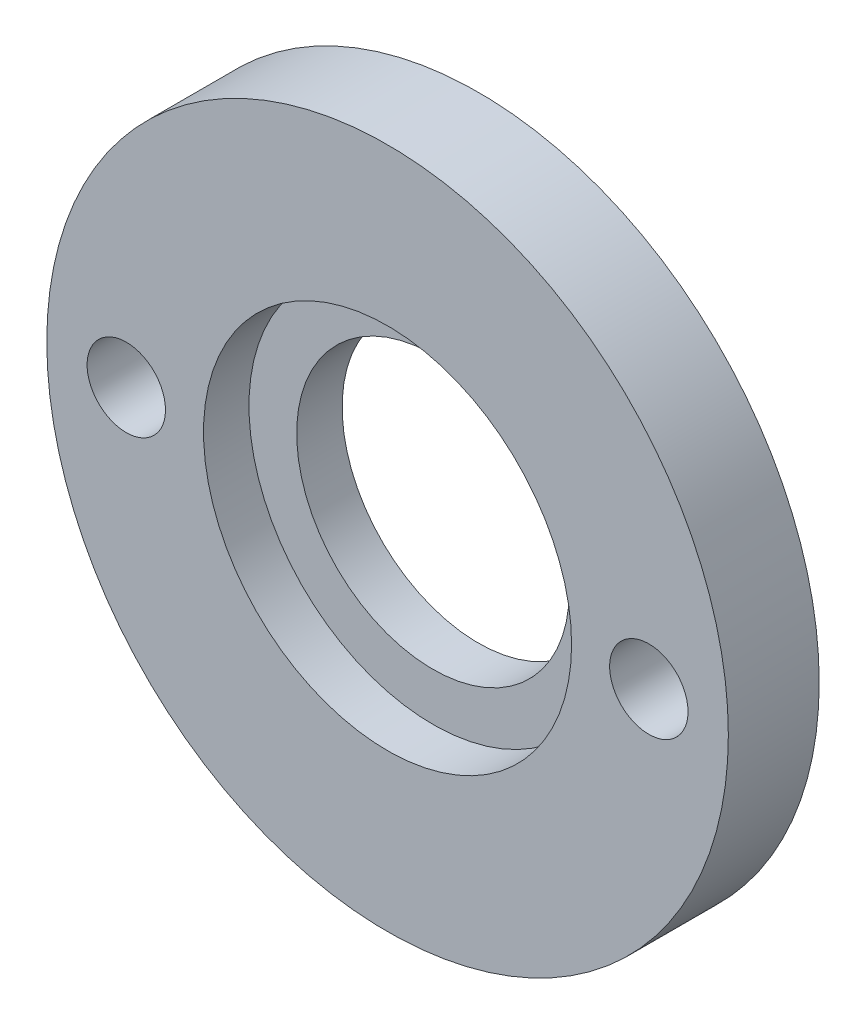
ISO-10303-21;
HEADER;
FILE_DESCRIPTION(('STEP AP214'),'2;1');
FILE_NAME('part.step','',(''),(''),'','','');
FILE_SCHEMA(('AUTOMOTIVE_DESIGN { 1 0 10303 214 1 1 1 1 }'));
ENDSEC;
DATA;
#1=APPLICATION_CONTEXT('core data for automotive mechanical design processes');
#2=APPLICATION_PROTOCOL_DEFINITION('international standard','automotive_design',2000,#1);
#3=PRODUCT_CONTEXT('',#1,'mechanical');
#4=PRODUCT('Part','Part','',(#3));
#5=PRODUCT_RELATED_PRODUCT_CATEGORY('part','',(#4));
#6=PRODUCT_DEFINITION_FORMATION('','',#4);
#7=PRODUCT_DEFINITION_CONTEXT('part definition',#1,'design');
#8=PRODUCT_DEFINITION('design','',#6,#7);
#9=PRODUCT_DEFINITION_SHAPE('','',#8);
#10=(LENGTH_UNIT() NAMED_UNIT(*) SI_UNIT(.MILLI.,.METRE.));
#11=(NAMED_UNIT(*) PLANE_ANGLE_UNIT() SI_UNIT($,.RADIAN.));
#12=(NAMED_UNIT(*) SI_UNIT($,.STERADIAN.) SOLID_ANGLE_UNIT());
#13=UNCERTAINTY_MEASURE_WITH_UNIT(LENGTH_MEASURE(1.E-05),#10,'distance_accuracy_value','');
#14=(GEOMETRIC_REPRESENTATION_CONTEXT(3) GLOBAL_UNCERTAINTY_ASSIGNED_CONTEXT((#13)) GLOBAL_UNIT_ASSIGNED_CONTEXT((#10,
#11,#12)) REPRESENTATION_CONTEXT('',''));
#15=CARTESIAN_POINT('',(0.,0.,0.));
#16=DIRECTION('',(0.,0.,1.));
#17=DIRECTION('',(1.,0.,0.));
#18=AXIS2_PLACEMENT_3D('',#15,#16,#17);
#19=CARTESIAN_POINT('',(0.,0.,4.));
#20=DIRECTION('',(0.,0.,-1.));
#21=DIRECTION('',(-1.,0.,0.));
#22=AXIS2_PLACEMENT_3D('',#19,#20,#21);
#23=CYLINDRICAL_SURFACE('',#22,6.);
#24=CARTESIAN_POINT('',(0.,0.,0.));
#25=DIRECTION('',(0.,0.,1.));
#26=DIRECTION('',(1.,0.,0.));
#27=AXIS2_PLACEMENT_3D('',#24,#25,#26);
#28=CIRCLE('',#27,6.);
#29=CARTESIAN_POINT('',(6.,0.,0.));
#30=VERTEX_POINT('',#29);
#31=EDGE_CURVE('E42',#30,#30,#28,.T.);
#32=ORIENTED_EDGE('',*,*,#31,.F.);
#33=EDGE_LOOP('',(#32));
#34=FACE_BOUND('',#33,.T.);
#35=CARTESIAN_POINT('',(0.,0.,2.));
#36=DIRECTION('',(0.,0.,1.));
#37=DIRECTION('',(1.,0.,0.));
#38=AXIS2_PLACEMENT_3D('',#35,#36,#37);
#39=CIRCLE('',#38,6.);
#40=CARTESIAN_POINT('',(6.,0.,2.));
#41=VERTEX_POINT('',#40);
#42=EDGE_CURVE('E62',#41,#41,#39,.T.);
#43=ORIENTED_EDGE('',*,*,#42,.T.);
#44=EDGE_LOOP('',(#43));
#45=FACE_BOUND('',#44,.T.);
#46=ADVANCED_FACE('F31',(#34,#45),#23,.F.);
#47=CARTESIAN_POINT('',(0.,0.,4.));
#48=DIRECTION('',(0.,0.,1.));
#49=DIRECTION('',(1.,0.,0.));
#50=AXIS2_PLACEMENT_3D('',#47,#48,#49);
#51=PLANE('',#50);
#52=CARTESIAN_POINT('',(0.,0.,4.));
#53=DIRECTION('',(0.,0.,1.));
#54=DIRECTION('',(1.,0.,0.));
#55=AXIS2_PLACEMENT_3D('',#52,#53,#54);
#56=CIRCLE('',#55,8.1);
#57=CARTESIAN_POINT('',(8.1,0.,4.));
#58=VERTEX_POINT('',#57);
#59=EDGE_CURVE('E59',#58,#58,#56,.T.);
#60=ORIENTED_EDGE('',*,*,#59,.F.);
#61=EDGE_LOOP('',(#60));
#62=FACE_BOUND('',#61,.T.);
#63=CARTESIAN_POINT('',(-11.5,0.,4.));
#64=DIRECTION('',(0.,0.,1.));
#65=DIRECTION('',(1.,0.,0.));
#66=AXIS2_PLACEMENT_3D('',#63,#64,#65);
#67=CIRCLE('',#66,1.725);
#68=CARTESIAN_POINT('',(-9.775,0.,4.));
#69=VERTEX_POINT('',#68);
#70=EDGE_CURVE('E46',#69,#69,#67,.T.);
#71=ORIENTED_EDGE('',*,*,#70,.F.);
#72=EDGE_LOOP('',(#71));
#73=FACE_BOUND('',#72,.T.);
#74=CARTESIAN_POINT('',(0.,0.,4.));
#75=DIRECTION('',(0.,0.,1.));
#76=DIRECTION('',(1.,0.,0.));
#77=AXIS2_PLACEMENT_3D('',#74,#75,#76);
#78=CIRCLE('',#77,15.);
#79=CARTESIAN_POINT('',(15.,0.,4.));
#80=VERTEX_POINT('',#79);
#81=EDGE_CURVE('E10',#80,#80,#78,.T.);
#82=ORIENTED_EDGE('',*,*,#81,.T.);
#83=EDGE_LOOP('',(#82));
#84=FACE_BOUND('',#83,.T.);
#85=CARTESIAN_POINT('',(11.5,0.,4.));
#86=DIRECTION('',(0.,0.,1.));
#87=DIRECTION('',(1.,0.,0.));
#88=AXIS2_PLACEMENT_3D('',#85,#86,#87);
#89=CIRCLE('',#88,1.725);
#90=CARTESIAN_POINT('',(13.225,0.,4.));
#91=VERTEX_POINT('',#90);
#92=EDGE_CURVE('E50',#91,#91,#89,.T.);
#93=ORIENTED_EDGE('',*,*,#92,.F.);
#94=EDGE_LOOP('',(#93));
#95=FACE_BOUND('',#94,.T.);
#96=ADVANCED_FACE('F82',(#62,#73,#84,#95),#51,.T.);
#97=CARTESIAN_POINT('',(0.,0.,0.));
#98=DIRECTION('',(0.,0.,1.));
#99=DIRECTION('',(1.,0.,0.));
#100=AXIS2_PLACEMENT_3D('',#97,#98,#99);
#101=PLANE('',#100);
#102=CARTESIAN_POINT('',(-11.5,0.,0.));
#103=DIRECTION('',(0.,0.,1.));
#104=DIRECTION('',(1.,0.,0.));
#105=AXIS2_PLACEMENT_3D('',#102,#103,#104);
#106=CIRCLE('',#105,1.725);
#107=CARTESIAN_POINT('',(-9.775,0.,0.));
#108=VERTEX_POINT('',#107);
#109=EDGE_CURVE('E47',#108,#108,#106,.T.);
#110=ORIENTED_EDGE('',*,*,#109,.T.);
#111=EDGE_LOOP('',(#110));
#112=FACE_BOUND('',#111,.T.);
#113=CARTESIAN_POINT('',(0.,0.,0.));
#114=DIRECTION('',(0.,0.,1.));
#115=DIRECTION('',(1.,0.,0.));
#116=AXIS2_PLACEMENT_3D('',#113,#114,#115);
#117=CIRCLE('',#116,15.);
#118=CARTESIAN_POINT('',(15.,0.,0.));
#119=VERTEX_POINT('',#118);
#120=EDGE_CURVE('E35',#119,#119,#117,.T.);
#121=ORIENTED_EDGE('',*,*,#120,.F.);
#122=EDGE_LOOP('',(#121));
#123=FACE_BOUND('',#122,.T.);
#124=ORIENTED_EDGE('',*,*,#31,.T.);
#125=EDGE_LOOP('',(#124));
#126=FACE_BOUND('',#125,.T.);
#127=CARTESIAN_POINT('',(11.5,0.,0.));
#128=DIRECTION('',(0.,0.,1.));
#129=DIRECTION('',(1.,0.,0.));
#130=AXIS2_PLACEMENT_3D('',#127,#128,#129);
#131=CIRCLE('',#130,1.725);
#132=CARTESIAN_POINT('',(13.225,0.,0.));
#133=VERTEX_POINT('',#132);
#134=EDGE_CURVE('E53',#133,#133,#131,.T.);
#135=ORIENTED_EDGE('',*,*,#134,.T.);
#136=EDGE_LOOP('',(#135));
#137=FACE_BOUND('',#136,.T.);
#138=ADVANCED_FACE('F85',(#112,#123,#126,#137),#101,.F.);
#139=CARTESIAN_POINT('',(0.,0.,4.));
#140=DIRECTION('',(0.,0.,-1.));
#141=DIRECTION('',(-1.,0.,0.));
#142=AXIS2_PLACEMENT_3D('',#139,#140,#141);
#143=CYLINDRICAL_SURFACE('',#142,15.);
#144=ORIENTED_EDGE('',*,*,#81,.F.);
#145=EDGE_LOOP('',(#144));
#146=FACE_BOUND('',#145,.T.);
#147=ORIENTED_EDGE('',*,*,#120,.T.);
#148=EDGE_LOOP('',(#147));
#149=FACE_BOUND('',#148,.T.);
#150=ADVANCED_FACE('F33',(#146,#149),#143,.T.);
#151=CARTESIAN_POINT('',(-11.5,0.,4.));
#152=DIRECTION('',(0.,0.,-1.));
#153=DIRECTION('',(-1.,0.,0.));
#154=AXIS2_PLACEMENT_3D('',#151,#152,#153);
#155=CYLINDRICAL_SURFACE('',#154,1.725);
#156=ORIENTED_EDGE('',*,*,#70,.T.);
#157=EDGE_LOOP('',(#156));
#158=FACE_BOUND('',#157,.T.);
#159=ORIENTED_EDGE('',*,*,#109,.F.);
#160=EDGE_LOOP('',(#159));
#161=FACE_BOUND('',#160,.T.);
#162=ADVANCED_FACE('F93',(#158,#161),#155,.F.);
#163=CARTESIAN_POINT('',(11.5,0.,4.));
#164=DIRECTION('',(0.,0.,-1.));
#165=DIRECTION('',(-1.,0.,0.));
#166=AXIS2_PLACEMENT_3D('',#163,#164,#165);
#167=CYLINDRICAL_SURFACE('',#166,1.725);
#168=ORIENTED_EDGE('',*,*,#92,.T.);
#169=EDGE_LOOP('',(#168));
#170=FACE_BOUND('',#169,.T.);
#171=ORIENTED_EDGE('',*,*,#134,.F.);
#172=EDGE_LOOP('',(#171));
#173=FACE_BOUND('',#172,.T.);
#174=ADVANCED_FACE('F78',(#170,#173),#167,.F.);
#175=CARTESIAN_POINT('',(0.,0.,2.));
#176=DIRECTION('',(0.,0.,1.));
#177=DIRECTION('',(1.,0.,0.));
#178=AXIS2_PLACEMENT_3D('',#175,#176,#177);
#179=CYLINDRICAL_SURFACE('',#178,8.1);
#180=CARTESIAN_POINT('',(0.,0.,2.));
#181=DIRECTION('',(0.,0.,1.));
#182=DIRECTION('',(1.,0.,0.));
#183=AXIS2_PLACEMENT_3D('',#180,#181,#182);
#184=CIRCLE('',#183,8.1);
#185=CARTESIAN_POINT('',(8.1,0.,2.));
#186=VERTEX_POINT('',#185);
#187=EDGE_CURVE('E56',#186,#186,#184,.T.);
#188=ORIENTED_EDGE('',*,*,#187,.F.);
#189=EDGE_LOOP('',(#188));
#190=FACE_BOUND('',#189,.T.);
#191=ORIENTED_EDGE('',*,*,#59,.T.);
#192=EDGE_LOOP('',(#191));
#193=FACE_BOUND('',#192,.T.);
#194=ADVANCED_FACE('F72',(#190,#193),#179,.F.);
#195=CARTESIAN_POINT('',(0.,0.,2.));
#196=DIRECTION('',(0.,0.,1.));
#197=DIRECTION('',(1.,0.,0.));
#198=AXIS2_PLACEMENT_3D('',#195,#196,#197);
#199=PLANE('',#198);
#200=ORIENTED_EDGE('',*,*,#42,.F.);
#201=EDGE_LOOP('',(#200));
#202=FACE_BOUND('',#201,.T.);
#203=ORIENTED_EDGE('',*,*,#187,.T.);
#204=EDGE_LOOP('',(#203));
#205=FACE_BOUND('',#204,.T.);
#206=ADVANCED_FACE('F69',(#202,#205),#199,.T.);
#207=CLOSED_SHELL('',(#46,#96,#138,#150,#162,#174,#194,#206));
#208=MANIFOLD_SOLID_BREP('B2',#207);
#209=ADVANCED_BREP_SHAPE_REPRESENTATION('',(#18,#208),#14);
#210=SHAPE_DEFINITION_REPRESENTATION(#9,#209);
ENDSEC;
END-ISO-10303-21;
